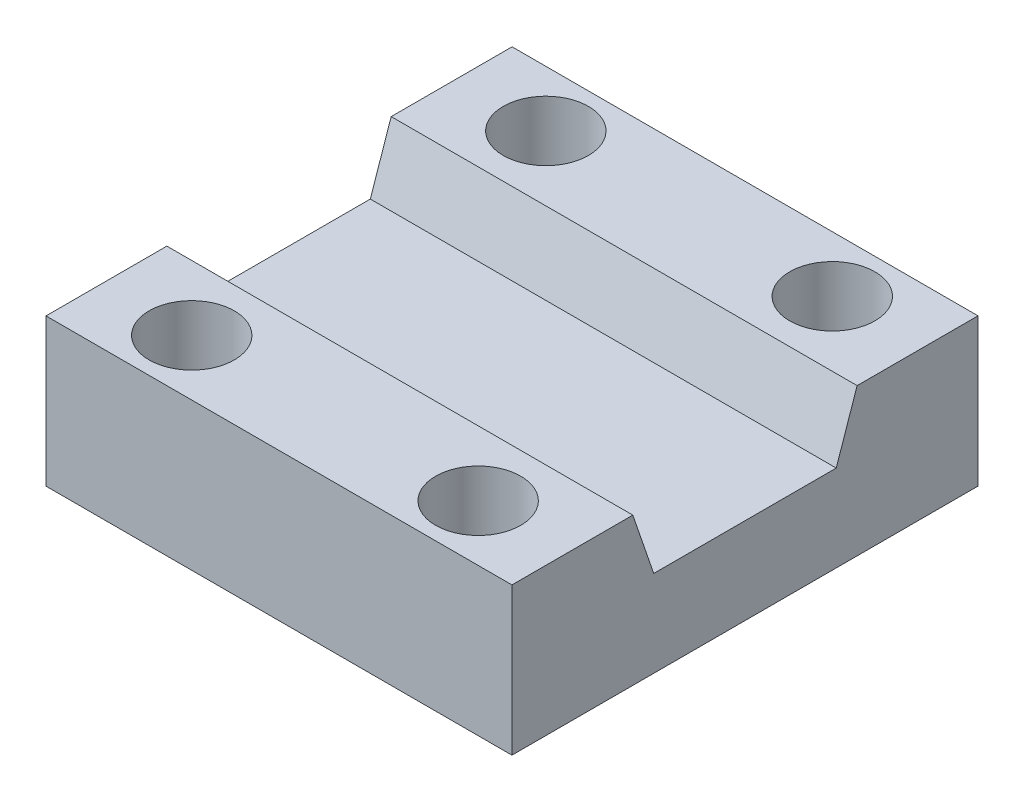
ISO-10303-21;
HEADER;
FILE_DESCRIPTION(('STEP AP214'),'2;1');
FILE_NAME('part.step','',(''),(''),'','','');
FILE_SCHEMA(('AUTOMOTIVE_DESIGN { 1 0 10303 214 1 1 1 1 }'));
ENDSEC;
DATA;
#1=APPLICATION_CONTEXT('core data for automotive mechanical design processes');
#2=APPLICATION_PROTOCOL_DEFINITION('international standard','automotive_design',2000,#1);
#3=PRODUCT_CONTEXT('',#1,'mechanical');
#4=PRODUCT('Part','Part','',(#3));
#5=PRODUCT_RELATED_PRODUCT_CATEGORY('part','',(#4));
#6=PRODUCT_DEFINITION_FORMATION('','',#4);
#7=PRODUCT_DEFINITION_CONTEXT('part definition',#1,'design');
#8=PRODUCT_DEFINITION('design','',#6,#7);
#9=PRODUCT_DEFINITION_SHAPE('','',#8);
#10=(LENGTH_UNIT() NAMED_UNIT(*) SI_UNIT(.MILLI.,.METRE.));
#11=(NAMED_UNIT(*) PLANE_ANGLE_UNIT() SI_UNIT($,.RADIAN.));
#12=(NAMED_UNIT(*) SI_UNIT($,.STERADIAN.) SOLID_ANGLE_UNIT());
#13=UNCERTAINTY_MEASURE_WITH_UNIT(LENGTH_MEASURE(1.E-05),#10,'distance_accuracy_value','');
#14=(GEOMETRIC_REPRESENTATION_CONTEXT(3) GLOBAL_UNCERTAINTY_ASSIGNED_CONTEXT((#13)) GLOBAL_UNIT_ASSIGNED_CONTEXT((#10,
#11,#12)) REPRESENTATION_CONTEXT('',''));
#15=CARTESIAN_POINT('',(0.,0.,0.));
#16=DIRECTION('',(0.,0.,1.));
#17=DIRECTION('',(1.,0.,0.));
#18=AXIS2_PLACEMENT_3D('',#15,#16,#17);
#19=CARTESIAN_POINT('',(19.145,12.12,-19.15));
#20=DIRECTION('',(-1.,0.,0.));
#21=DIRECTION('',(0.,0.,1.));
#22=AXIS2_PLACEMENT_3D('',#19,#20,#21);
#23=PLANE('',#22);
#24=DIRECTION('',(0.,-0.946020801838197,0.324105912456737));
#25=VECTOR('',#24,1.);
#26=CARTESIAN_POINT('',(19.145,-1.55271460577144,-4.53216143217952));
#27=LINE('',#26,#25);
#28=CARTESIAN_POINT('',(19.145,12.12,-9.21642168782455));
#29=VERTEX_POINT('',#28);
#30=CARTESIAN_POINT('',(19.145,7.11,-7.5));
#31=VERTEX_POINT('',#30);
#32=EDGE_CURVE('E138',#29,#31,#27,.T.);
#33=ORIENTED_EDGE('',*,*,#32,.T.);
#34=DIRECTION('',(0.,0.,-1.));
#35=VECTOR('',#34,1.);
#36=CARTESIAN_POINT('',(19.145,7.11,0.));
#37=LINE('',#36,#35);
#38=CARTESIAN_POINT('',(19.145,7.11,7.5));
#39=VERTEX_POINT('',#38);
#40=EDGE_CURVE('E141',#39,#31,#37,.T.);
#41=ORIENTED_EDGE('',*,*,#40,.F.);
#42=DIRECTION('',(0.,-0.946020801838197,-0.324105912456737));
#43=VECTOR('',#42,1.);
#44=CARTESIAN_POINT('',(19.145,-1.55271460577144,4.53216143217952));
#45=LINE('',#44,#43);
#46=CARTESIAN_POINT('',(19.145,12.12,9.21642168782455));
#47=VERTEX_POINT('',#46);
#48=EDGE_CURVE('E119',#47,#39,#45,.T.);
#49=ORIENTED_EDGE('',*,*,#48,.F.);
#50=DIRECTION('',(0.,0.,-1.));
#51=VECTOR('',#50,1.);
#52=CARTESIAN_POINT('',(19.145,12.12,-19.15));
#53=LINE('',#52,#51);
#54=CARTESIAN_POINT('',(19.145,12.12,19.15));
#55=VERTEX_POINT('',#54);
#56=EDGE_CURVE('E155',#55,#47,#53,.T.);
#57=ORIENTED_EDGE('',*,*,#56,.F.);
#58=DIRECTION('',(0.,-1.,0.));
#59=VECTOR('',#58,1.);
#60=CARTESIAN_POINT('',(19.145,12.12,19.15));
#61=LINE('',#60,#59);
#62=CARTESIAN_POINT('',(19.145,0.,19.15));
#63=VERTEX_POINT('',#62);
#64=EDGE_CURVE('E163',#55,#63,#61,.T.);
#65=ORIENTED_EDGE('',*,*,#64,.T.);
#66=DIRECTION('',(0.,0.,-1.));
#67=VECTOR('',#66,1.);
#68=CARTESIAN_POINT('',(19.145,0.,-19.15));
#69=LINE('',#68,#67);
#70=CARTESIAN_POINT('',(19.145,0.,-19.15));
#71=VERTEX_POINT('',#70);
#72=EDGE_CURVE('E152',#63,#71,#69,.T.);
#73=ORIENTED_EDGE('',*,*,#72,.T.);
#74=DIRECTION('',(0.,-1.,0.));
#75=VECTOR('',#74,1.);
#76=CARTESIAN_POINT('',(19.145,12.12,-19.15));
#77=LINE('',#76,#75);
#78=CARTESIAN_POINT('',(19.145,12.12,-19.15));
#79=VERTEX_POINT('',#78);
#80=EDGE_CURVE('E11',#79,#71,#77,.T.);
#81=ORIENTED_EDGE('',*,*,#80,.F.);
#82=EDGE_CURVE('E94',#29,#79,#53,.T.);
#83=ORIENTED_EDGE('',*,*,#82,.F.);
#84=EDGE_LOOP('',(#33,#41,#49,#57,#65,#73,#81,#83));
#85=FACE_BOUND('',#84,.T.);
#86=ADVANCED_FACE('F42',(#85),#23,.F.);
#87=CARTESIAN_POINT('',(-19.145,12.12,-19.15));
#88=DIRECTION('',(1.,0.,0.));
#89=DIRECTION('',(0.,0.,-1.));
#90=AXIS2_PLACEMENT_3D('',#87,#88,#89);
#91=PLANE('',#90);
#92=DIRECTION('',(0.,-0.946020801838197,0.324105912456737));
#93=VECTOR('',#92,1.);
#94=CARTESIAN_POINT('',(-19.145,-1.55271460577144,-4.53216143217952));
#95=LINE('',#94,#93);
#96=CARTESIAN_POINT('',(-19.145,12.12,-9.21642168782455));
#97=VERTEX_POINT('',#96);
#98=CARTESIAN_POINT('',(-19.145,7.11,-7.5));
#99=VERTEX_POINT('',#98);
#100=EDGE_CURVE('E132',#97,#99,#95,.T.);
#101=ORIENTED_EDGE('',*,*,#100,.F.);
#102=DIRECTION('',(0.,0.,1.));
#103=VECTOR('',#102,1.);
#104=CARTESIAN_POINT('',(-19.145,12.12,-19.15));
#105=LINE('',#104,#103);
#106=CARTESIAN_POINT('',(-19.145,12.12,-19.15));
#107=VERTEX_POINT('',#106);
#108=EDGE_CURVE('E159',#107,#97,#105,.T.);
#109=ORIENTED_EDGE('',*,*,#108,.F.);
#110=DIRECTION('',(0.,-1.,0.));
#111=VECTOR('',#110,1.);
#112=CARTESIAN_POINT('',(-19.145,12.12,-19.15));
#113=LINE('',#112,#111);
#114=CARTESIAN_POINT('',(-19.145,0.,-19.15));
#115=VERTEX_POINT('',#114);
#116=EDGE_CURVE('E49',#107,#115,#113,.T.);
#117=ORIENTED_EDGE('',*,*,#116,.T.);
#118=DIRECTION('',(0.,0.,1.));
#119=VECTOR('',#118,1.);
#120=CARTESIAN_POINT('',(-19.145,0.,-19.15));
#121=LINE('',#120,#119);
#122=CARTESIAN_POINT('',(-19.145,0.,19.15));
#123=VERTEX_POINT('',#122);
#124=EDGE_CURVE('E168',#115,#123,#121,.T.);
#125=ORIENTED_EDGE('',*,*,#124,.T.);
#126=DIRECTION('',(0.,-1.,0.));
#127=VECTOR('',#126,1.);
#128=CARTESIAN_POINT('',(-19.145,12.12,19.15));
#129=LINE('',#128,#127);
#130=CARTESIAN_POINT('',(-19.145,12.12,19.15));
#131=VERTEX_POINT('',#130);
#132=EDGE_CURVE('E172',#131,#123,#129,.T.);
#133=ORIENTED_EDGE('',*,*,#132,.F.);
#134=CARTESIAN_POINT('',(-19.145,12.12,9.21642168782455));
#135=VERTEX_POINT('',#134);
#136=EDGE_CURVE('E137',#135,#131,#105,.T.);
#137=ORIENTED_EDGE('',*,*,#136,.F.);
#138=DIRECTION('',(0.,-0.946020801838197,-0.324105912456737));
#139=VECTOR('',#138,1.);
#140=CARTESIAN_POINT('',(-19.145,-1.55271460577144,4.53216143217952));
#141=LINE('',#140,#139);
#142=CARTESIAN_POINT('',(-19.145,7.11,7.5));
#143=VERTEX_POINT('',#142);
#144=EDGE_CURVE('E56',#135,#143,#141,.T.);
#145=ORIENTED_EDGE('',*,*,#144,.T.);
#146=DIRECTION('',(0.,0.,-1.));
#147=VECTOR('',#146,1.);
#148=CARTESIAN_POINT('',(-19.145,7.11,0.));
#149=LINE('',#148,#147);
#150=EDGE_CURVE('E128',#143,#99,#149,.T.);
#151=ORIENTED_EDGE('',*,*,#150,.T.);
#152=EDGE_LOOP('',(#101,#109,#117,#125,#133,#137,#145,#151));
#153=FACE_BOUND('',#152,.T.);
#154=ADVANCED_FACE('F135',(#153),#91,.F.);
#155=CARTESIAN_POINT('',(0.,12.12,0.));
#156=DIRECTION('',(0.,1.,0.));
#157=DIRECTION('',(0.,0.,1.));
#158=AXIS2_PLACEMENT_3D('',#155,#156,#157);
#159=PLANE('',#158);
#160=CARTESIAN_POINT('',(-11.77,12.12,-14.55));
#161=DIRECTION('',(0.,1.,0.));
#162=DIRECTION('',(0.,0.,1.));
#163=AXIS2_PLACEMENT_3D('',#160,#161,#162);
#164=CIRCLE('',#163,3.49999999999999);
#165=CARTESIAN_POINT('',(-11.77,12.12,-11.05));
#166=VERTEX_POINT('',#165);
#167=EDGE_CURVE('E253',#166,#166,#164,.T.);
#168=ORIENTED_EDGE('',*,*,#167,.F.);
#169=EDGE_LOOP('',(#168));
#170=FACE_BOUND('',#169,.T.);
#171=CARTESIAN_POINT('',(11.77,12.12,-14.55));
#172=DIRECTION('',(0.,1.,0.));
#173=DIRECTION('',(0.,0.,1.));
#174=AXIS2_PLACEMENT_3D('',#171,#172,#173);
#175=CIRCLE('',#174,3.49999999999999);
#176=CARTESIAN_POINT('',(11.77,12.12,-11.05));
#177=VERTEX_POINT('',#176);
#178=EDGE_CURVE('E249',#177,#177,#175,.T.);
#179=ORIENTED_EDGE('',*,*,#178,.F.);
#180=EDGE_LOOP('',(#179));
#181=FACE_BOUND('',#180,.T.);
#182=ORIENTED_EDGE('',*,*,#108,.T.);
#183=DIRECTION('',(1.,0.,0.));
#184=VECTOR('',#183,1.);
#185=CARTESIAN_POINT('',(-19.145,12.12,-9.21642168782455));
#186=LINE('',#185,#184);
#187=EDGE_CURVE('E150',#97,#29,#186,.T.);
#188=ORIENTED_EDGE('',*,*,#187,.T.);
#189=ORIENTED_EDGE('',*,*,#82,.T.);
#190=DIRECTION('',(-1.,0.,0.));
#191=VECTOR('',#190,1.);
#192=CARTESIAN_POINT('',(-19.145,12.12,-19.15));
#193=LINE('',#192,#191);
#194=EDGE_CURVE('E157',#79,#107,#193,.T.);
#195=ORIENTED_EDGE('',*,*,#194,.T.);
#196=EDGE_LOOP('',(#182,#188,#189,#195));
#197=FACE_BOUND('',#196,.T.);
#198=ADVANCED_FACE('F196',(#170,#181,#197),#159,.T.);
#199=CARTESIAN_POINT('',(-19.145,12.12,-19.15));
#200=DIRECTION('',(0.,0.,1.));
#201=DIRECTION('',(1.,0.,0.));
#202=AXIS2_PLACEMENT_3D('',#199,#200,#201);
#203=PLANE('',#202);
#204=DIRECTION('',(-1.,0.,0.));
#205=VECTOR('',#204,1.);
#206=CARTESIAN_POINT('',(-19.145,0.,-19.15));
#207=LINE('',#206,#205);
#208=EDGE_CURVE('E166',#71,#115,#207,.T.);
#209=ORIENTED_EDGE('',*,*,#208,.T.);
#210=ORIENTED_EDGE('',*,*,#116,.F.);
#211=ORIENTED_EDGE('',*,*,#194,.F.);
#212=ORIENTED_EDGE('',*,*,#80,.T.);
#213=EDGE_LOOP('',(#209,#210,#211,#212));
#214=FACE_BOUND('',#213,.T.);
#215=ADVANCED_FACE('F187',(#214),#203,.F.);
#216=CARTESIAN_POINT('',(-19.145,12.12,19.15));
#217=DIRECTION('',(0.,0.,-1.));
#218=DIRECTION('',(-1.,0.,0.));
#219=AXIS2_PLACEMENT_3D('',#216,#217,#218);
#220=PLANE('',#219);
#221=DIRECTION('',(1.,0.,0.));
#222=VECTOR('',#221,1.);
#223=CARTESIAN_POINT('',(-19.145,0.,19.15));
#224=LINE('',#223,#222);
#225=EDGE_CURVE('E86',#123,#63,#224,.T.);
#226=ORIENTED_EDGE('',*,*,#225,.T.);
#227=ORIENTED_EDGE('',*,*,#64,.F.);
#228=DIRECTION('',(1.,0.,0.));
#229=VECTOR('',#228,1.);
#230=CARTESIAN_POINT('',(-19.145,12.12,19.15));
#231=LINE('',#230,#229);
#232=EDGE_CURVE('E65',#131,#55,#231,.T.);
#233=ORIENTED_EDGE('',*,*,#232,.F.);
#234=ORIENTED_EDGE('',*,*,#132,.T.);
#235=EDGE_LOOP('',(#226,#227,#233,#234));
#236=FACE_BOUND('',#235,.T.);
#237=ADVANCED_FACE('F184',(#236),#220,.F.);
#238=CARTESIAN_POINT('',(-11.77,12.12,14.55));
#239=DIRECTION('',(0.,1.,0.));
#240=DIRECTION('',(0.,0.,1.));
#241=AXIS2_PLACEMENT_3D('',#238,#239,#240);
#242=CIRCLE('',#241,3.49999999999999);
#243=CARTESIAN_POINT('',(-11.77,12.12,18.05));
#244=VERTEX_POINT('',#243);
#245=EDGE_CURVE('E243',#244,#244,#242,.T.);
#246=ORIENTED_EDGE('',*,*,#245,.F.);
#247=EDGE_LOOP('',(#246));
#248=FACE_BOUND('',#247,.T.);
#249=CARTESIAN_POINT('',(11.77,12.12,14.55));
#250=DIRECTION('',(0.,1.,0.));
#251=DIRECTION('',(0.,0.,1.));
#252=AXIS2_PLACEMENT_3D('',#249,#250,#251);
#253=CIRCLE('',#252,3.49999999999999);
#254=CARTESIAN_POINT('',(11.77,12.12,18.05));
#255=VERTEX_POINT('',#254);
#256=EDGE_CURVE('E239',#255,#255,#253,.T.);
#257=ORIENTED_EDGE('',*,*,#256,.F.);
#258=EDGE_LOOP('',(#257));
#259=FACE_BOUND('',#258,.T.);
#260=DIRECTION('',(1.,0.,0.));
#261=VECTOR('',#260,1.);
#262=CARTESIAN_POINT('',(-19.145,12.12,9.21642168782455));
#263=LINE('',#262,#261);
#264=EDGE_CURVE('E124',#135,#47,#263,.T.);
#265=ORIENTED_EDGE('',*,*,#264,.F.);
#266=ORIENTED_EDGE('',*,*,#136,.T.);
#267=ORIENTED_EDGE('',*,*,#232,.T.);
#268=ORIENTED_EDGE('',*,*,#56,.T.);
#269=EDGE_LOOP('',(#265,#266,#267,#268));
#270=FACE_BOUND('',#269,.T.);
#271=ADVANCED_FACE('F186',(#248,#259,#270),#159,.T.);
#272=CARTESIAN_POINT('',(0.,0.,0.));
#273=DIRECTION('',(0.,1.,0.));
#274=DIRECTION('',(0.,0.,1.));
#275=AXIS2_PLACEMENT_3D('',#272,#273,#274);
#276=PLANE('',#275);
#277=CARTESIAN_POINT('',(-11.77,0.,-14.55));
#278=DIRECTION('',(0.,1.,0.));
#279=DIRECTION('',(0.,0.,1.));
#280=AXIS2_PLACEMENT_3D('',#277,#278,#279);
#281=CIRCLE('',#280,3.49999999999999);
#282=CARTESIAN_POINT('',(-11.77,0.,-11.05));
#283=VERTEX_POINT('',#282);
#284=EDGE_CURVE('E227',#283,#283,#281,.T.);
#285=ORIENTED_EDGE('',*,*,#284,.T.);
#286=EDGE_LOOP('',(#285));
#287=FACE_BOUND('',#286,.T.);
#288=CARTESIAN_POINT('',(11.77,0.,-14.55));
#289=DIRECTION('',(0.,1.,0.));
#290=DIRECTION('',(0.,0.,1.));
#291=AXIS2_PLACEMENT_3D('',#288,#289,#290);
#292=CIRCLE('',#291,3.49999999999999);
#293=CARTESIAN_POINT('',(11.77,0.,-11.05));
#294=VERTEX_POINT('',#293);
#295=EDGE_CURVE('E231',#294,#294,#292,.T.);
#296=ORIENTED_EDGE('',*,*,#295,.T.);
#297=EDGE_LOOP('',(#296));
#298=FACE_BOUND('',#297,.T.);
#299=CARTESIAN_POINT('',(-11.77,0.,14.55));
#300=DIRECTION('',(0.,1.,0.));
#301=DIRECTION('',(0.,0.,1.));
#302=AXIS2_PLACEMENT_3D('',#299,#300,#301);
#303=CIRCLE('',#302,3.49999999999999);
#304=CARTESIAN_POINT('',(-11.77,0.,18.05));
#305=VERTEX_POINT('',#304);
#306=EDGE_CURVE('E235',#305,#305,#303,.T.);
#307=ORIENTED_EDGE('',*,*,#306,.T.);
#308=EDGE_LOOP('',(#307));
#309=FACE_BOUND('',#308,.T.);
#310=CARTESIAN_POINT('',(11.77,0.,14.55));
#311=DIRECTION('',(0.,1.,0.));
#312=DIRECTION('',(0.,0.,1.));
#313=AXIS2_PLACEMENT_3D('',#310,#311,#312);
#314=CIRCLE('',#313,3.49999999999999);
#315=CARTESIAN_POINT('',(11.77,0.,18.05));
#316=VERTEX_POINT('',#315);
#317=EDGE_CURVE('E144',#316,#316,#314,.T.);
#318=ORIENTED_EDGE('',*,*,#317,.T.);
#319=EDGE_LOOP('',(#318));
#320=FACE_BOUND('',#319,.T.);
#321=ORIENTED_EDGE('',*,*,#72,.F.);
#322=ORIENTED_EDGE('',*,*,#225,.F.);
#323=ORIENTED_EDGE('',*,*,#124,.F.);
#324=ORIENTED_EDGE('',*,*,#208,.F.);
#325=EDGE_LOOP('',(#321,#322,#323,#324));
#326=FACE_BOUND('',#325,.T.);
#327=ADVANCED_FACE('F180',(#287,#298,#309,#320,#326),#276,.F.);
#328=CARTESIAN_POINT('',(-19.145,-1.55271460577144,-4.53216143217952));
#329=DIRECTION('',(0.,0.324105912456737,0.946020801838197));
#330=DIRECTION('',(0.,-0.946020801838197,0.324105912456737));
#331=AXIS2_PLACEMENT_3D('',#328,#329,#330);
#332=PLANE('',#331);
#333=ORIENTED_EDGE('',*,*,#32,.F.);
#334=ORIENTED_EDGE('',*,*,#187,.F.);
#335=ORIENTED_EDGE('',*,*,#100,.T.);
#336=DIRECTION('',(1.,0.,0.));
#337=VECTOR('',#336,1.);
#338=CARTESIAN_POINT('',(-19.145,7.11,-7.5));
#339=LINE('',#338,#337);
#340=EDGE_CURVE('E123',#99,#31,#339,.T.);
#341=ORIENTED_EDGE('',*,*,#340,.T.);
#342=EDGE_LOOP('',(#333,#334,#335,#341));
#343=FACE_BOUND('',#342,.T.);
#344=ADVANCED_FACE('F216',(#343),#332,.T.);
#345=CARTESIAN_POINT('',(-19.145,7.11,0.));
#346=DIRECTION('',(0.,-1.,0.));
#347=DIRECTION('',(0.,0.,-1.));
#348=AXIS2_PLACEMENT_3D('',#345,#346,#347);
#349=PLANE('',#348);
#350=ORIENTED_EDGE('',*,*,#40,.T.);
#351=ORIENTED_EDGE('',*,*,#340,.F.);
#352=ORIENTED_EDGE('',*,*,#150,.F.);
#353=DIRECTION('',(1.,0.,0.));
#354=VECTOR('',#353,1.);
#355=CARTESIAN_POINT('',(-19.145,7.11,7.5));
#356=LINE('',#355,#354);
#357=EDGE_CURVE('E115',#143,#39,#356,.T.);
#358=ORIENTED_EDGE('',*,*,#357,.T.);
#359=EDGE_LOOP('',(#350,#351,#352,#358));
#360=FACE_BOUND('',#359,.T.);
#361=ADVANCED_FACE('F129',(#360),#349,.F.);
#362=CARTESIAN_POINT('',(-19.145,-1.55271460577144,4.53216143217952));
#363=DIRECTION('',(0.,-0.324105912456737,0.946020801838197));
#364=DIRECTION('',(0.,-0.946020801838197,-0.324105912456737));
#365=AXIS2_PLACEMENT_3D('',#362,#363,#364);
#366=PLANE('',#365);
#367=ORIENTED_EDGE('',*,*,#48,.T.);
#368=ORIENTED_EDGE('',*,*,#357,.F.);
#369=ORIENTED_EDGE('',*,*,#144,.F.);
#370=ORIENTED_EDGE('',*,*,#264,.T.);
#371=EDGE_LOOP('',(#367,#368,#369,#370));
#372=FACE_BOUND('',#371,.T.);
#373=ADVANCED_FACE('F117',(#372),#366,.F.);
#374=CARTESIAN_POINT('',(11.77,12.12,14.55));
#375=DIRECTION('',(0.,1.,0.));
#376=DIRECTION('',(0.,0.,1.));
#377=AXIS2_PLACEMENT_3D('',#374,#375,#376);
#378=CYLINDRICAL_SURFACE('',#377,3.49999999999999);
#379=ORIENTED_EDGE('',*,*,#317,.F.);
#380=EDGE_LOOP('',(#379));
#381=FACE_BOUND('',#380,.T.);
#382=ORIENTED_EDGE('',*,*,#256,.T.);
#383=EDGE_LOOP('',(#382));
#384=FACE_BOUND('',#383,.T.);
#385=ADVANCED_FACE('F270',(#381,#384),#378,.F.);
#386=CARTESIAN_POINT('',(-11.77,12.12,14.55));
#387=DIRECTION('',(0.,1.,0.));
#388=DIRECTION('',(0.,0.,1.));
#389=AXIS2_PLACEMENT_3D('',#386,#387,#388);
#390=CYLINDRICAL_SURFACE('',#389,3.49999999999999);
#391=ORIENTED_EDGE('',*,*,#306,.F.);
#392=EDGE_LOOP('',(#391));
#393=FACE_BOUND('',#392,.T.);
#394=ORIENTED_EDGE('',*,*,#245,.T.);
#395=EDGE_LOOP('',(#394));
#396=FACE_BOUND('',#395,.T.);
#397=ADVANCED_FACE('F264',(#393,#396),#390,.F.);
#398=CARTESIAN_POINT('',(11.77,12.12,-14.55));
#399=DIRECTION('',(0.,1.,0.));
#400=DIRECTION('',(0.,0.,1.));
#401=AXIS2_PLACEMENT_3D('',#398,#399,#400);
#402=CYLINDRICAL_SURFACE('',#401,3.49999999999999);
#403=ORIENTED_EDGE('',*,*,#295,.F.);
#404=EDGE_LOOP('',(#403));
#405=FACE_BOUND('',#404,.T.);
#406=ORIENTED_EDGE('',*,*,#178,.T.);
#407=EDGE_LOOP('',(#406));
#408=FACE_BOUND('',#407,.T.);
#409=ADVANCED_FACE('F257',(#405,#408),#402,.F.);
#410=CARTESIAN_POINT('',(-11.77,12.12,-14.55));
#411=DIRECTION('',(0.,1.,0.));
#412=DIRECTION('',(0.,0.,1.));
#413=AXIS2_PLACEMENT_3D('',#410,#411,#412);
#414=CYLINDRICAL_SURFACE('',#413,3.49999999999999);
#415=ORIENTED_EDGE('',*,*,#284,.F.);
#416=EDGE_LOOP('',(#415));
#417=FACE_BOUND('',#416,.T.);
#418=ORIENTED_EDGE('',*,*,#167,.T.);
#419=EDGE_LOOP('',(#418));
#420=FACE_BOUND('',#419,.T.);
#421=ADVANCED_FACE('F256',(#417,#420),#414,.F.);
#422=CLOSED_SHELL('',(#86,#154,#198,#215,#237,#271,#327,#344,#361,#373,#385,#397,#409,#421));
#423=MANIFOLD_SOLID_BREP('B2',#422);
#424=ADVANCED_BREP_SHAPE_REPRESENTATION('',(#18,#423),#14);
#425=SHAPE_DEFINITION_REPRESENTATION(#9,#424);
ENDSEC;
END-ISO-10303-21;
